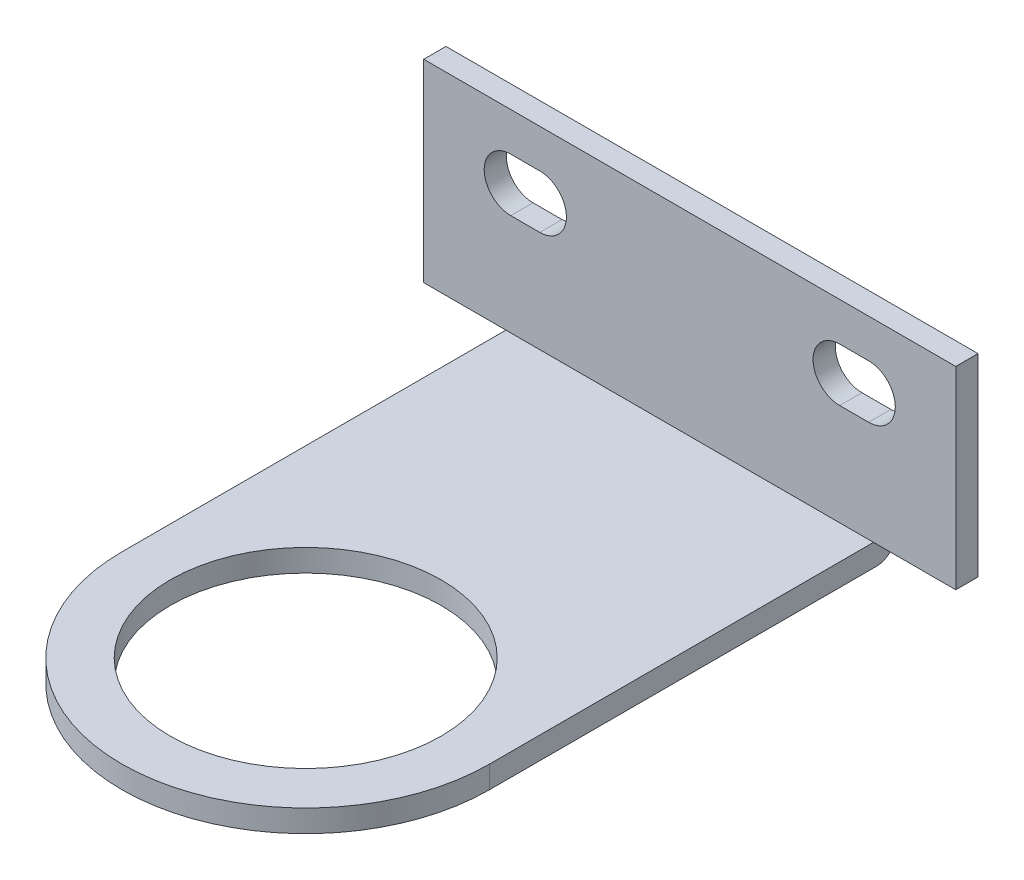
ISO-10303-21;
HEADER;
FILE_DESCRIPTION(('STEP AP214'),'2;1');
FILE_NAME('part.step','',(''),(''),'','','');
FILE_SCHEMA(('AUTOMOTIVE_DESIGN { 1 0 10303 214 1 1 1 1 }'));
ENDSEC;
DATA;
#1=APPLICATION_CONTEXT('core data for automotive mechanical design processes');
#2=APPLICATION_PROTOCOL_DEFINITION('international standard','automotive_design',2000,#1);
#3=PRODUCT_CONTEXT('',#1,'mechanical');
#4=PRODUCT('Part','Part','',(#3));
#5=PRODUCT_RELATED_PRODUCT_CATEGORY('part','',(#4));
#6=PRODUCT_DEFINITION_FORMATION('','',#4);
#7=PRODUCT_DEFINITION_CONTEXT('part definition',#1,'design');
#8=PRODUCT_DEFINITION('design','',#6,#7);
#9=PRODUCT_DEFINITION_SHAPE('','',#8);
#10=(LENGTH_UNIT() NAMED_UNIT(*) SI_UNIT(.MILLI.,.METRE.));
#11=(NAMED_UNIT(*) PLANE_ANGLE_UNIT() SI_UNIT($,.RADIAN.));
#12=(NAMED_UNIT(*) SI_UNIT($,.STERADIAN.) SOLID_ANGLE_UNIT());
#13=UNCERTAINTY_MEASURE_WITH_UNIT(LENGTH_MEASURE(1.E-05),#10,'distance_accuracy_value','');
#14=(GEOMETRIC_REPRESENTATION_CONTEXT(3) GLOBAL_UNCERTAINTY_ASSIGNED_CONTEXT((#13)) GLOBAL_UNIT_ASSIGNED_CONTEXT((#10,
#11,#12)) REPRESENTATION_CONTEXT('',''));
#15=CARTESIAN_POINT('',(0.,0.,0.));
#16=DIRECTION('',(0.,0.,1.));
#17=DIRECTION('',(1.,0.,0.));
#18=AXIS2_PLACEMENT_3D('',#15,#16,#17);
#19=CARTESIAN_POINT('',(0.,2.3,0.));
#20=DIRECTION('',(0.,1.,0.));
#21=DIRECTION('',(0.,0.,1.));
#22=AXIS2_PLACEMENT_3D('',#19,#20,#21);
#23=PLANE('',#22);
#24=DIRECTION('',(1.,0.,0.));
#25=VECTOR('',#24,1.);
#26=CARTESIAN_POINT('',(-27.5,2.3,-39.7));
#27=LINE('',#26,#25);
#28=CARTESIAN_POINT('',(-19.,2.3,-39.7));
#29=VERTEX_POINT('',#28);
#30=CARTESIAN_POINT('',(19.,2.3,-39.7));
#31=VERTEX_POINT('',#30);
#32=EDGE_CURVE('E221',#29,#31,#27,.T.);
#33=ORIENTED_EDGE('',*,*,#32,.F.);
#34=DIRECTION('',(0.,0.,1.));
#35=VECTOR('',#34,1.);
#36=CARTESIAN_POINT('',(-19.,2.3,0.));
#37=LINE('',#36,#35);
#38=CARTESIAN_POINT('',(-19.,2.3,0.));
#39=VERTEX_POINT('',#38);
#40=EDGE_CURVE('E265',#29,#39,#37,.T.);
#41=ORIENTED_EDGE('',*,*,#40,.T.);
#42=CARTESIAN_POINT('',(0.,2.3,0.));
#43=DIRECTION('',(0.,1.,0.));
#44=DIRECTION('',(0.,0.,1.));
#45=AXIS2_PLACEMENT_3D('',#42,#43,#44);
#46=CIRCLE('',#45,19.);
#47=CARTESIAN_POINT('',(19.,2.3,0.));
#48=VERTEX_POINT('',#47);
#49=EDGE_CURVE('E291',#39,#48,#46,.T.);
#50=ORIENTED_EDGE('',*,*,#49,.T.);
#51=DIRECTION('',(0.,0.,-1.));
#52=VECTOR('',#51,1.);
#53=CARTESIAN_POINT('',(19.,2.3,0.));
#54=LINE('',#53,#52);
#55=EDGE_CURVE('E270',#48,#31,#54,.T.);
#56=ORIENTED_EDGE('',*,*,#55,.T.);
#57=EDGE_LOOP('',(#33,#41,#50,#56));
#58=FACE_BOUND('',#57,.T.);
#59=CARTESIAN_POINT('',(0.,2.3,0.));
#60=DIRECTION('',(0.,1.,0.));
#61=DIRECTION('',(0.,0.,1.));
#62=AXIS2_PLACEMENT_3D('',#59,#60,#61);
#63=CIRCLE('',#62,14.);
#64=CARTESIAN_POINT('',(0.,2.3,14.));
#65=VERTEX_POINT('',#64);
#66=EDGE_CURVE('E287',#65,#65,#63,.T.);
#67=ORIENTED_EDGE('',*,*,#66,.F.);
#68=EDGE_LOOP('',(#67));
#69=FACE_BOUND('',#68,.T.);
#70=ADVANCED_FACE('F32',(#58,#69),#23,.T.);
#71=CARTESIAN_POINT('',(0.,0.,0.));
#72=DIRECTION('',(0.,1.,0.));
#73=DIRECTION('',(0.,0.,1.));
#74=AXIS2_PLACEMENT_3D('',#71,#72,#73);
#75=PLANE('',#74);
#76=DIRECTION('',(0.,0.,1.));
#77=VECTOR('',#76,1.);
#78=CARTESIAN_POINT('',(-19.,0.,0.));
#79=LINE('',#78,#77);
#80=CARTESIAN_POINT('',(-19.,0.,-40.));
#81=VERTEX_POINT('',#80);
#82=CARTESIAN_POINT('',(-19.,0.,0.));
#83=VERTEX_POINT('',#82);
#84=EDGE_CURVE('E290',#81,#83,#79,.T.);
#85=ORIENTED_EDGE('',*,*,#84,.F.);
#86=DIRECTION('',(-1.,0.,0.));
#87=VECTOR('',#86,1.);
#88=CARTESIAN_POINT('',(0.,0.,-40.));
#89=LINE('',#88,#87);
#90=CARTESIAN_POINT('',(19.,0.,-40.));
#91=VERTEX_POINT('',#90);
#92=EDGE_CURVE('E307',#81,#91,#89,.F.);
#93=ORIENTED_EDGE('',*,*,#92,.T.);
#94=DIRECTION('',(0.,0.,-1.));
#95=VECTOR('',#94,1.);
#96=CARTESIAN_POINT('',(19.,0.,0.));
#97=LINE('',#96,#95);
#98=CARTESIAN_POINT('',(19.,0.,0.));
#99=VERTEX_POINT('',#98);
#100=EDGE_CURVE('E286',#99,#91,#97,.T.);
#101=ORIENTED_EDGE('',*,*,#100,.F.);
#102=CARTESIAN_POINT('',(0.,0.,0.));
#103=DIRECTION('',(0.,1.,0.));
#104=DIRECTION('',(0.,0.,1.));
#105=AXIS2_PLACEMENT_3D('',#102,#103,#104);
#106=CIRCLE('',#105,19.);
#107=EDGE_CURVE('E283',#83,#99,#106,.T.);
#108=ORIENTED_EDGE('',*,*,#107,.F.);
#109=EDGE_LOOP('',(#85,#93,#101,#108));
#110=FACE_BOUND('',#109,.T.);
#111=CARTESIAN_POINT('',(0.,0.,0.));
#112=DIRECTION('',(0.,1.,0.));
#113=DIRECTION('',(0.,0.,1.));
#114=AXIS2_PLACEMENT_3D('',#111,#112,#113);
#115=CIRCLE('',#114,14.);
#116=CARTESIAN_POINT('',(0.,0.,14.));
#117=VERTEX_POINT('',#116);
#118=EDGE_CURVE('E238',#117,#117,#115,.T.);
#119=ORIENTED_EDGE('',*,*,#118,.T.);
#120=EDGE_LOOP('',(#119));
#121=FACE_BOUND('',#120,.T.);
#122=ADVANCED_FACE('F346',(#110,#121),#75,.F.);
#123=CARTESIAN_POINT('',(0.,2.3,0.));
#124=DIRECTION('',(0.,-1.,0.));
#125=DIRECTION('',(0.,0.,-1.));
#126=AXIS2_PLACEMENT_3D('',#123,#124,#125);
#127=CYLINDRICAL_SURFACE('',#126,19.);
#128=ORIENTED_EDGE('',*,*,#107,.T.);
#129=DIRECTION('',(0.,-1.,0.));
#130=VECTOR('',#129,1.);
#131=CARTESIAN_POINT('',(19.,2.3,0.));
#132=LINE('',#131,#130);
#133=EDGE_CURVE('E293',#48,#99,#132,.T.);
#134=ORIENTED_EDGE('',*,*,#133,.F.);
#135=ORIENTED_EDGE('',*,*,#49,.F.);
#136=DIRECTION('',(0.,-1.,0.));
#137=VECTOR('',#136,1.);
#138=CARTESIAN_POINT('',(-19.,2.3,0.));
#139=LINE('',#138,#137);
#140=EDGE_CURVE('E264',#39,#83,#139,.T.);
#141=ORIENTED_EDGE('',*,*,#140,.T.);
#142=EDGE_LOOP('',(#128,#134,#135,#141));
#143=FACE_BOUND('',#142,.T.);
#144=ADVANCED_FACE('F352',(#143),#127,.T.);
#145=CARTESIAN_POINT('',(19.,2.3,0.));
#146=DIRECTION('',(-1.,0.,0.));
#147=DIRECTION('',(0.,0.,1.));
#148=AXIS2_PLACEMENT_3D('',#145,#146,#147);
#149=PLANE('',#148);
#150=ORIENTED_EDGE('',*,*,#100,.T.);
#151=CARTESIAN_POINT('',(19.,2.,-40.));
#152=DIRECTION('',(-1.,0.,0.));
#153=DIRECTION('',(0.,0.,1.));
#154=AXIS2_PLACEMENT_3D('',#151,#152,#153);
#155=CIRCLE('',#154,2.);
#156=CARTESIAN_POINT('',(19.,2.,-42.));
#157=VERTEX_POINT('',#156);
#158=EDGE_CURVE('E309',#91,#157,#155,.F.);
#159=ORIENTED_EDGE('',*,*,#158,.T.);
#160=DIRECTION('',(0.,-1.,0.));
#161=VECTOR('',#160,1.);
#162=CARTESIAN_POINT('',(19.,2.3,-42.));
#163=LINE('',#162,#161);
#164=CARTESIAN_POINT('',(19.,2.3,-42.));
#165=VERTEX_POINT('',#164);
#166=EDGE_CURVE('E295',#165,#157,#163,.T.);
#167=ORIENTED_EDGE('',*,*,#166,.F.);
#168=EDGE_CURVE('E276',#31,#165,#54,.T.);
#169=ORIENTED_EDGE('',*,*,#168,.F.);
#170=ORIENTED_EDGE('',*,*,#55,.F.);
#171=ORIENTED_EDGE('',*,*,#133,.T.);
#172=EDGE_LOOP('',(#150,#159,#167,#169,#170,#171));
#173=FACE_BOUND('',#172,.T.);
#174=ADVANCED_FACE('F365',(#173),#149,.F.);
#175=CARTESIAN_POINT('',(-19.,2.3,-42.));
#176=DIRECTION('',(0.,0.,1.));
#177=DIRECTION('',(1.,0.,0.));
#178=AXIS2_PLACEMENT_3D('',#175,#176,#177);
#179=PLANE('',#178);
#180=DIRECTION('',(-1.,0.,0.));
#181=VECTOR('',#180,1.);
#182=CARTESIAN_POINT('',(-15.5,12.8,-42.));
#183=LINE('',#182,#181);
#184=CARTESIAN_POINT('',(-15.5,12.8,-42.));
#185=VERTEX_POINT('',#184);
#186=CARTESIAN_POINT('',(-18.5,12.8,-42.));
#187=VERTEX_POINT('',#186);
#188=EDGE_CURVE('E169',#185,#187,#183,.T.);
#189=ORIENTED_EDGE('',*,*,#188,.F.);
#190=CARTESIAN_POINT('',(-15.5,15.55,-42.));
#191=DIRECTION('',(0.,0.,-1.));
#192=DIRECTION('',(-1.,0.,0.));
#193=AXIS2_PLACEMENT_3D('',#190,#191,#192);
#194=CIRCLE('',#193,2.75);
#195=CARTESIAN_POINT('',(-15.5,18.3,-42.));
#196=VERTEX_POINT('',#195);
#197=EDGE_CURVE('E47',#196,#185,#194,.T.);
#198=ORIENTED_EDGE('',*,*,#197,.F.);
#199=DIRECTION('',(1.,0.,0.));
#200=VECTOR('',#199,1.);
#201=CARTESIAN_POINT('',(-15.5,18.3,-42.));
#202=LINE('',#201,#200);
#203=CARTESIAN_POINT('',(-18.5,18.3,-42.));
#204=VERTEX_POINT('',#203);
#205=EDGE_CURVE('E176',#204,#196,#202,.T.);
#206=ORIENTED_EDGE('',*,*,#205,.F.);
#207=CARTESIAN_POINT('',(-18.5,15.55,-42.));
#208=DIRECTION('',(0.,0.,-1.));
#209=DIRECTION('',(-1.,0.,0.));
#210=AXIS2_PLACEMENT_3D('',#207,#208,#209);
#211=CIRCLE('',#210,2.75);
#212=EDGE_CURVE('E160',#187,#204,#211,.T.);
#213=ORIENTED_EDGE('',*,*,#212,.F.);
#214=EDGE_LOOP('',(#189,#198,#206,#213));
#215=FACE_BOUND('',#214,.T.);
#216=DIRECTION('',(-1.,0.,0.));
#217=VECTOR('',#216,1.);
#218=CARTESIAN_POINT('',(18.5,12.8,-42.));
#219=LINE('',#218,#217);
#220=CARTESIAN_POINT('',(18.5,12.8,-42.));
#221=VERTEX_POINT('',#220);
#222=CARTESIAN_POINT('',(15.5,12.8,-42.));
#223=VERTEX_POINT('',#222);
#224=EDGE_CURVE('E187',#221,#223,#219,.T.);
#225=ORIENTED_EDGE('',*,*,#224,.F.);
#226=CARTESIAN_POINT('',(18.5,15.55,-42.));
#227=DIRECTION('',(0.,0.,-1.));
#228=DIRECTION('',(-1.,0.,0.));
#229=AXIS2_PLACEMENT_3D('',#226,#227,#228);
#230=CIRCLE('',#229,2.75);
#231=CARTESIAN_POINT('',(18.5,18.3,-42.));
#232=VERTEX_POINT('',#231);
#233=EDGE_CURVE('E183',#232,#221,#230,.T.);
#234=ORIENTED_EDGE('',*,*,#233,.F.);
#235=DIRECTION('',(1.,0.,0.));
#236=VECTOR('',#235,1.);
#237=CARTESIAN_POINT('',(18.5,18.3,-42.));
#238=LINE('',#237,#236);
#239=CARTESIAN_POINT('',(15.5,18.3,-42.));
#240=VERTEX_POINT('',#239);
#241=EDGE_CURVE('E193',#240,#232,#238,.T.);
#242=ORIENTED_EDGE('',*,*,#241,.F.);
#243=CARTESIAN_POINT('',(15.5,15.55,-42.));
#244=DIRECTION('',(0.,0.,-1.));
#245=DIRECTION('',(-1.,0.,0.));
#246=AXIS2_PLACEMENT_3D('',#243,#244,#245);
#247=CIRCLE('',#246,2.75);
#248=EDGE_CURVE('E190',#223,#240,#247,.T.);
#249=ORIENTED_EDGE('',*,*,#248,.F.);
#250=EDGE_LOOP('',(#225,#234,#242,#249));
#251=FACE_BOUND('',#250,.T.);
#252=ORIENTED_EDGE('',*,*,#166,.T.);
#253=DIRECTION('',(-1.,0.,0.));
#254=VECTOR('',#253,1.);
#255=CARTESIAN_POINT('',(-19.,2.,-42.));
#256=LINE('',#255,#254);
#257=CARTESIAN_POINT('',(-19.,2.,-42.));
#258=VERTEX_POINT('',#257);
#259=EDGE_CURVE('E303',#157,#258,#256,.T.);
#260=ORIENTED_EDGE('',*,*,#259,.T.);
#261=DIRECTION('',(0.,-1.,0.));
#262=VECTOR('',#261,1.);
#263=CARTESIAN_POINT('',(-19.,2.3,-42.));
#264=LINE('',#263,#262);
#265=CARTESIAN_POINT('',(-19.,2.3,-42.));
#266=VERTEX_POINT('',#265);
#267=EDGE_CURVE('E268',#266,#258,#264,.T.);
#268=ORIENTED_EDGE('',*,*,#267,.F.);
#269=DIRECTION('',(-1.,0.,0.));
#270=VECTOR('',#269,1.);
#271=CARTESIAN_POINT('',(0.,2.3,-42.));
#272=LINE('',#271,#270);
#273=CARTESIAN_POINT('',(-27.5,2.3,-42.));
#274=VERTEX_POINT('',#273);
#275=EDGE_CURVE('E224',#266,#274,#272,.T.);
#276=ORIENTED_EDGE('',*,*,#275,.T.);
#277=DIRECTION('',(0.,-1.,0.));
#278=VECTOR('',#277,1.);
#279=CARTESIAN_POINT('',(-27.5,22.3,-42.));
#280=LINE('',#279,#278);
#281=CARTESIAN_POINT('',(-27.5,22.3,-42.));
#282=VERTEX_POINT('',#281);
#283=EDGE_CURVE('E242',#282,#274,#280,.T.);
#284=ORIENTED_EDGE('',*,*,#283,.F.);
#285=DIRECTION('',(-1.,0.,0.));
#286=VECTOR('',#285,1.);
#287=CARTESIAN_POINT('',(0.,22.3,-42.));
#288=LINE('',#287,#286);
#289=CARTESIAN_POINT('',(27.5,22.3,-42.));
#290=VERTEX_POINT('',#289);
#291=EDGE_CURVE('E212',#290,#282,#288,.T.);
#292=ORIENTED_EDGE('',*,*,#291,.F.);
#293=DIRECTION('',(0.,-1.,0.));
#294=VECTOR('',#293,1.);
#295=CARTESIAN_POINT('',(27.5,22.3,-42.));
#296=LINE('',#295,#294);
#297=CARTESIAN_POINT('',(27.5,2.3,-42.));
#298=VERTEX_POINT('',#297);
#299=EDGE_CURVE('E239',#290,#298,#296,.T.);
#300=ORIENTED_EDGE('',*,*,#299,.T.);
#301=EDGE_CURVE('E232',#298,#165,#272,.T.);
#302=ORIENTED_EDGE('',*,*,#301,.T.);
#303=EDGE_LOOP('',(#252,#260,#268,#276,#284,#292,#300,#302));
#304=FACE_BOUND('',#303,.T.);
#305=ADVANCED_FACE('F173',(#215,#251,#304),#179,.F.);
#306=CARTESIAN_POINT('',(-19.,2.3,0.));
#307=DIRECTION('',(1.,0.,0.));
#308=DIRECTION('',(0.,0.,-1.));
#309=AXIS2_PLACEMENT_3D('',#306,#307,#308);
#310=PLANE('',#309);
#311=ORIENTED_EDGE('',*,*,#267,.T.);
#312=CARTESIAN_POINT('',(-19.,2.,-40.));
#313=DIRECTION('',(1.,0.,0.));
#314=DIRECTION('',(0.,0.,-1.));
#315=AXIS2_PLACEMENT_3D('',#312,#313,#314);
#316=CIRCLE('',#315,2.);
#317=EDGE_CURVE('E305',#258,#81,#316,.F.);
#318=ORIENTED_EDGE('',*,*,#317,.T.);
#319=ORIENTED_EDGE('',*,*,#84,.T.);
#320=ORIENTED_EDGE('',*,*,#140,.F.);
#321=ORIENTED_EDGE('',*,*,#40,.F.);
#322=EDGE_CURVE('E260',#266,#29,#37,.T.);
#323=ORIENTED_EDGE('',*,*,#322,.F.);
#324=EDGE_LOOP('',(#311,#318,#319,#320,#321,#323));
#325=FACE_BOUND('',#324,.T.);
#326=ADVANCED_FACE('F360',(#325),#310,.F.);
#327=CARTESIAN_POINT('',(0.,2.3,0.));
#328=DIRECTION('',(0.,-1.,0.));
#329=DIRECTION('',(0.,0.,-1.));
#330=AXIS2_PLACEMENT_3D('',#327,#328,#329);
#331=CYLINDRICAL_SURFACE('',#330,14.);
#332=ORIENTED_EDGE('',*,*,#66,.T.);
#333=EDGE_LOOP('',(#332));
#334=FACE_BOUND('',#333,.T.);
#335=ORIENTED_EDGE('',*,*,#118,.F.);
#336=EDGE_LOOP('',(#335));
#337=FACE_BOUND('',#336,.T.);
#338=ADVANCED_FACE('F357',(#334,#337),#331,.F.);
#339=CARTESIAN_POINT('',(27.5,2.3,-39.7));
#340=DIRECTION('',(0.,-1.,0.));
#341=DIRECTION('',(0.,0.,-1.));
#342=AXIS2_PLACEMENT_3D('',#339,#340,#341);
#343=PLANE('',#342);
#344=CARTESIAN_POINT('',(27.5,2.3,-39.7));
#345=VERTEX_POINT('',#344);
#346=EDGE_CURVE('E199',#31,#345,#27,.T.);
#347=ORIENTED_EDGE('',*,*,#346,.F.);
#348=ORIENTED_EDGE('',*,*,#168,.T.);
#349=ORIENTED_EDGE('',*,*,#301,.F.);
#350=DIRECTION('',(0.,0.,-1.));
#351=VECTOR('',#350,1.);
#352=CARTESIAN_POINT('',(27.5,2.3,-42.));
#353=LINE('',#352,#351);
#354=EDGE_CURVE('E220',#345,#298,#353,.T.);
#355=ORIENTED_EDGE('',*,*,#354,.F.);
#356=EDGE_LOOP('',(#347,#348,#349,#355));
#357=FACE_BOUND('',#356,.T.);
#358=ADVANCED_FACE('F391',(#357),#343,.T.);
#359=CARTESIAN_POINT('',(-27.5,22.3,-39.7));
#360=DIRECTION('',(0.,0.,-1.));
#361=DIRECTION('',(-1.,0.,0.));
#362=AXIS2_PLACEMENT_3D('',#359,#360,#361);
#363=PLANE('',#362);
#364=DIRECTION('',(1.,0.,0.));
#365=VECTOR('',#364,1.);
#366=CARTESIAN_POINT('',(-27.5,18.3,-39.7));
#367=LINE('',#366,#365);
#368=CARTESIAN_POINT('',(-18.5,18.3,-39.7));
#369=VERTEX_POINT('',#368);
#370=CARTESIAN_POINT('',(-15.5,18.3,-39.7));
#371=VERTEX_POINT('',#370);
#372=EDGE_CURVE('E40',#369,#371,#367,.T.);
#373=ORIENTED_EDGE('',*,*,#372,.T.);
#374=CARTESIAN_POINT('',(-15.5,15.55,-39.7));
#375=DIRECTION('',(0.,0.,-1.));
#376=DIRECTION('',(-1.,0.,0.));
#377=AXIS2_PLACEMENT_3D('',#374,#375,#376);
#378=CIRCLE('',#377,2.75);
#379=CARTESIAN_POINT('',(-15.5,12.8,-39.7));
#380=VERTEX_POINT('',#379);
#381=EDGE_CURVE('E11',#371,#380,#378,.T.);
#382=ORIENTED_EDGE('',*,*,#381,.T.);
#383=DIRECTION('',(-1.,0.,0.));
#384=VECTOR('',#383,1.);
#385=CARTESIAN_POINT('',(-27.5,12.8,-39.7));
#386=LINE('',#385,#384);
#387=CARTESIAN_POINT('',(-18.5,12.8,-39.7));
#388=VERTEX_POINT('',#387);
#389=EDGE_CURVE('E323',#380,#388,#386,.T.);
#390=ORIENTED_EDGE('',*,*,#389,.T.);
#391=CARTESIAN_POINT('',(-18.5,15.55,-39.7));
#392=DIRECTION('',(0.,0.,-1.));
#393=DIRECTION('',(-1.,0.,0.));
#394=AXIS2_PLACEMENT_3D('',#391,#392,#393);
#395=CIRCLE('',#394,2.75);
#396=EDGE_CURVE('E163',#388,#369,#395,.T.);
#397=ORIENTED_EDGE('',*,*,#396,.T.);
#398=EDGE_LOOP('',(#373,#382,#390,#397));
#399=FACE_BOUND('',#398,.T.);
#400=DIRECTION('',(1.,0.,0.));
#401=VECTOR('',#400,1.);
#402=CARTESIAN_POINT('',(-27.5,18.3,-39.7));
#403=LINE('',#402,#401);
#404=CARTESIAN_POINT('',(15.5,18.3,-39.7));
#405=VERTEX_POINT('',#404);
#406=CARTESIAN_POINT('',(18.5,18.3,-39.7));
#407=VERTEX_POINT('',#406);
#408=EDGE_CURVE('E317',#405,#407,#403,.T.);
#409=ORIENTED_EDGE('',*,*,#408,.T.);
#410=CARTESIAN_POINT('',(18.5,15.55,-39.7));
#411=DIRECTION('',(0.,0.,-1.));
#412=DIRECTION('',(-1.,0.,0.));
#413=AXIS2_PLACEMENT_3D('',#410,#411,#412);
#414=CIRCLE('',#413,2.75);
#415=CARTESIAN_POINT('',(18.5,12.8,-39.7));
#416=VERTEX_POINT('',#415);
#417=EDGE_CURVE('E320',#407,#416,#414,.T.);
#418=ORIENTED_EDGE('',*,*,#417,.T.);
#419=DIRECTION('',(-1.,0.,0.));
#420=VECTOR('',#419,1.);
#421=CARTESIAN_POINT('',(-27.5,12.8,-39.7));
#422=LINE('',#421,#420);
#423=CARTESIAN_POINT('',(15.5,12.8,-39.7));
#424=VERTEX_POINT('',#423);
#425=EDGE_CURVE('E311',#416,#424,#422,.T.);
#426=ORIENTED_EDGE('',*,*,#425,.T.);
#427=CARTESIAN_POINT('',(15.5,15.55,-39.7));
#428=DIRECTION('',(0.,0.,-1.));
#429=DIRECTION('',(-1.,0.,0.));
#430=AXIS2_PLACEMENT_3D('',#427,#428,#429);
#431=CIRCLE('',#430,2.75);
#432=EDGE_CURVE('E314',#424,#405,#431,.T.);
#433=ORIENTED_EDGE('',*,*,#432,.T.);
#434=EDGE_LOOP('',(#409,#418,#426,#433));
#435=FACE_BOUND('',#434,.T.);
#436=CARTESIAN_POINT('',(-27.5,2.3,-39.7));
#437=VERTEX_POINT('',#436);
#438=EDGE_CURVE('E217',#437,#29,#27,.T.);
#439=ORIENTED_EDGE('',*,*,#438,.T.);
#440=ORIENTED_EDGE('',*,*,#32,.T.);
#441=ORIENTED_EDGE('',*,*,#346,.T.);
#442=DIRECTION('',(0.,-1.,0.));
#443=VECTOR('',#442,1.);
#444=CARTESIAN_POINT('',(27.5,22.3,-39.7));
#445=LINE('',#444,#443);
#446=CARTESIAN_POINT('',(27.5,22.3,-39.7));
#447=VERTEX_POINT('',#446);
#448=EDGE_CURVE('E235',#447,#345,#445,.T.);
#449=ORIENTED_EDGE('',*,*,#448,.F.);
#450=DIRECTION('',(1.,0.,0.));
#451=VECTOR('',#450,1.);
#452=CARTESIAN_POINT('',(-27.5,22.3,-39.7));
#453=LINE('',#452,#451);
#454=CARTESIAN_POINT('',(-27.5,22.3,-39.7));
#455=VERTEX_POINT('',#454);
#456=EDGE_CURVE('E206',#455,#447,#453,.T.);
#457=ORIENTED_EDGE('',*,*,#456,.F.);
#458=DIRECTION('',(0.,-1.,0.));
#459=VECTOR('',#458,1.);
#460=CARTESIAN_POINT('',(-27.5,22.3,-39.7));
#461=LINE('',#460,#459);
#462=EDGE_CURVE('E216',#455,#437,#461,.T.);
#463=ORIENTED_EDGE('',*,*,#462,.T.);
#464=EDGE_LOOP('',(#439,#440,#441,#449,#457,#463));
#465=FACE_BOUND('',#464,.T.);
#466=ADVANCED_FACE('F249',(#399,#435,#465),#363,.F.);
#467=CARTESIAN_POINT('',(27.5,22.3,-42.));
#468=DIRECTION('',(-1.,0.,0.));
#469=DIRECTION('',(0.,0.,1.));
#470=AXIS2_PLACEMENT_3D('',#467,#468,#469);
#471=PLANE('',#470);
#472=ORIENTED_EDGE('',*,*,#354,.T.);
#473=ORIENTED_EDGE('',*,*,#299,.F.);
#474=DIRECTION('',(0.,0.,-1.));
#475=VECTOR('',#474,1.);
#476=CARTESIAN_POINT('',(27.5,22.3,-42.));
#477=LINE('',#476,#475);
#478=EDGE_CURVE('E209',#447,#290,#477,.T.);
#479=ORIENTED_EDGE('',*,*,#478,.F.);
#480=ORIENTED_EDGE('',*,*,#448,.T.);
#481=EDGE_LOOP('',(#472,#473,#479,#480));
#482=FACE_BOUND('',#481,.T.);
#483=ADVANCED_FACE('F401',(#482),#471,.F.);
#484=CARTESIAN_POINT('',(-27.5,22.3,-42.));
#485=DIRECTION('',(1.,0.,0.));
#486=DIRECTION('',(0.,0.,-1.));
#487=AXIS2_PLACEMENT_3D('',#484,#485,#486);
#488=PLANE('',#487);
#489=DIRECTION('',(0.,0.,1.));
#490=VECTOR('',#489,1.);
#491=CARTESIAN_POINT('',(-27.5,2.3,-42.));
#492=LINE('',#491,#490);
#493=EDGE_CURVE('E210',#274,#437,#492,.T.);
#494=ORIENTED_EDGE('',*,*,#493,.T.);
#495=ORIENTED_EDGE('',*,*,#462,.F.);
#496=DIRECTION('',(0.,0.,1.));
#497=VECTOR('',#496,1.);
#498=CARTESIAN_POINT('',(-27.5,22.3,-42.));
#499=LINE('',#498,#497);
#500=EDGE_CURVE('E214',#282,#455,#499,.T.);
#501=ORIENTED_EDGE('',*,*,#500,.F.);
#502=ORIENTED_EDGE('',*,*,#283,.T.);
#503=EDGE_LOOP('',(#494,#495,#501,#502));
#504=FACE_BOUND('',#503,.T.);
#505=ADVANCED_FACE('F412',(#504),#488,.F.);
#506=CARTESIAN_POINT('',(27.5,22.3,-39.7));
#507=DIRECTION('',(0.,-1.,0.));
#508=DIRECTION('',(0.,0.,-1.));
#509=AXIS2_PLACEMENT_3D('',#506,#507,#508);
#510=PLANE('',#509);
#511=ORIENTED_EDGE('',*,*,#456,.T.);
#512=ORIENTED_EDGE('',*,*,#478,.T.);
#513=ORIENTED_EDGE('',*,*,#291,.T.);
#514=ORIENTED_EDGE('',*,*,#500,.T.);
#515=EDGE_LOOP('',(#511,#512,#513,#514));
#516=FACE_BOUND('',#515,.T.);
#517=ADVANCED_FACE('F405',(#516),#510,.F.);
#518=ORIENTED_EDGE('',*,*,#275,.F.);
#519=ORIENTED_EDGE('',*,*,#322,.T.);
#520=ORIENTED_EDGE('',*,*,#438,.F.);
#521=ORIENTED_EDGE('',*,*,#493,.F.);
#522=EDGE_LOOP('',(#518,#519,#520,#521));
#523=FACE_BOUND('',#522,.T.);
#524=ADVANCED_FACE('F258',(#523),#343,.T.);
#525=CARTESIAN_POINT('',(-19.,2.,-40.));
#526=DIRECTION('',(-1.,0.,0.));
#527=DIRECTION('',(0.,0.,1.));
#528=AXIS2_PLACEMENT_3D('',#525,#526,#527);
#529=CYLINDRICAL_SURFACE('',#528,2.);
#530=ORIENTED_EDGE('',*,*,#158,.F.);
#531=ORIENTED_EDGE('',*,*,#92,.F.);
#532=ORIENTED_EDGE('',*,*,#317,.F.);
#533=ORIENTED_EDGE('',*,*,#259,.F.);
#534=EDGE_LOOP('',(#530,#531,#532,#533));
#535=FACE_BOUND('',#534,.T.);
#536=ADVANCED_FACE('F34',(#535),#529,.T.);
#537=CARTESIAN_POINT('',(18.5,15.55,19.));
#538=DIRECTION('',(0.,0.,-1.));
#539=DIRECTION('',(-1.,0.,0.));
#540=AXIS2_PLACEMENT_3D('',#537,#538,#539);
#541=CYLINDRICAL_SURFACE('',#540,2.75);
#542=DIRECTION('',(0.,0.,-1.));
#543=VECTOR('',#542,1.);
#544=CARTESIAN_POINT('',(18.5,18.3,19.));
#545=LINE('',#544,#543);
#546=EDGE_CURVE('E197',#407,#232,#545,.T.);
#547=ORIENTED_EDGE('',*,*,#546,.T.);
#548=ORIENTED_EDGE('',*,*,#233,.T.);
#549=DIRECTION('',(0.,0.,-1.));
#550=VECTOR('',#549,1.);
#551=CARTESIAN_POINT('',(18.5,12.8,19.));
#552=LINE('',#551,#550);
#553=EDGE_CURVE('E196',#416,#221,#552,.T.);
#554=ORIENTED_EDGE('',*,*,#553,.F.);
#555=ORIENTED_EDGE('',*,*,#417,.F.);
#556=EDGE_LOOP('',(#547,#548,#554,#555));
#557=FACE_BOUND('',#556,.T.);
#558=ADVANCED_FACE('F410',(#557),#541,.F.);
#559=CARTESIAN_POINT('',(18.5,18.3,19.));
#560=DIRECTION('',(0.,1.,0.));
#561=DIRECTION('',(0.,0.,1.));
#562=AXIS2_PLACEMENT_3D('',#559,#560,#561);
#563=PLANE('',#562);
#564=DIRECTION('',(0.,0.,-1.));
#565=VECTOR('',#564,1.);
#566=CARTESIAN_POINT('',(15.5,18.3,19.));
#567=LINE('',#566,#565);
#568=EDGE_CURVE('E200',#405,#240,#567,.T.);
#569=ORIENTED_EDGE('',*,*,#568,.T.);
#570=ORIENTED_EDGE('',*,*,#241,.T.);
#571=ORIENTED_EDGE('',*,*,#546,.F.);
#572=ORIENTED_EDGE('',*,*,#408,.F.);
#573=EDGE_LOOP('',(#569,#570,#571,#572));
#574=FACE_BOUND('',#573,.T.);
#575=ADVANCED_FACE('F419',(#574),#563,.F.);
#576=CARTESIAN_POINT('',(15.5,15.55,19.));
#577=DIRECTION('',(0.,0.,-1.));
#578=DIRECTION('',(-1.,0.,0.));
#579=AXIS2_PLACEMENT_3D('',#576,#577,#578);
#580=CYLINDRICAL_SURFACE('',#579,2.75);
#581=DIRECTION('',(0.,0.,-1.));
#582=VECTOR('',#581,1.);
#583=CARTESIAN_POINT('',(15.5,12.8,19.));
#584=LINE('',#583,#582);
#585=EDGE_CURVE('E202',#424,#223,#584,.T.);
#586=ORIENTED_EDGE('',*,*,#585,.T.);
#587=ORIENTED_EDGE('',*,*,#248,.T.);
#588=ORIENTED_EDGE('',*,*,#568,.F.);
#589=ORIENTED_EDGE('',*,*,#432,.F.);
#590=EDGE_LOOP('',(#586,#587,#588,#589));
#591=FACE_BOUND('',#590,.T.);
#592=ADVANCED_FACE('F340',(#591),#580,.F.);
#593=CARTESIAN_POINT('',(18.5,12.8,19.));
#594=DIRECTION('',(0.,-1.,0.));
#595=DIRECTION('',(0.,0.,-1.));
#596=AXIS2_PLACEMENT_3D('',#593,#594,#595);
#597=PLANE('',#596);
#598=ORIENTED_EDGE('',*,*,#553,.T.);
#599=ORIENTED_EDGE('',*,*,#224,.T.);
#600=ORIENTED_EDGE('',*,*,#585,.F.);
#601=ORIENTED_EDGE('',*,*,#425,.F.);
#602=EDGE_LOOP('',(#598,#599,#600,#601));
#603=FACE_BOUND('',#602,.T.);
#604=ADVANCED_FACE('F333',(#603),#597,.F.);
#605=CARTESIAN_POINT('',(-15.5,15.55,19.));
#606=DIRECTION('',(0.,0.,-1.));
#607=DIRECTION('',(-1.,0.,0.));
#608=AXIS2_PLACEMENT_3D('',#605,#606,#607);
#609=CYLINDRICAL_SURFACE('',#608,2.75);
#610=DIRECTION('',(0.,0.,-1.));
#611=VECTOR('',#610,1.);
#612=CARTESIAN_POINT('',(-15.5,18.3,19.));
#613=LINE('',#612,#611);
#614=EDGE_CURVE('E181',#371,#196,#613,.T.);
#615=ORIENTED_EDGE('',*,*,#614,.T.);
#616=ORIENTED_EDGE('',*,*,#197,.T.);
#617=DIRECTION('',(0.,0.,-1.));
#618=VECTOR('',#617,1.);
#619=CARTESIAN_POINT('',(-15.5,12.8,19.));
#620=LINE('',#619,#618);
#621=EDGE_CURVE('E166',#380,#185,#620,.T.);
#622=ORIENTED_EDGE('',*,*,#621,.F.);
#623=ORIENTED_EDGE('',*,*,#381,.F.);
#624=EDGE_LOOP('',(#615,#616,#622,#623));
#625=FACE_BOUND('',#624,.T.);
#626=ADVANCED_FACE('F331',(#625),#609,.F.);
#627=CARTESIAN_POINT('',(-15.5,18.3,19.));
#628=DIRECTION('',(0.,1.,0.));
#629=DIRECTION('',(0.,0.,1.));
#630=AXIS2_PLACEMENT_3D('',#627,#628,#629);
#631=PLANE('',#630);
#632=DIRECTION('',(0.,0.,-1.));
#633=VECTOR('',#632,1.);
#634=CARTESIAN_POINT('',(-18.5,18.3,19.));
#635=LINE('',#634,#633);
#636=EDGE_CURVE('E165',#369,#204,#635,.T.);
#637=ORIENTED_EDGE('',*,*,#636,.T.);
#638=ORIENTED_EDGE('',*,*,#205,.T.);
#639=ORIENTED_EDGE('',*,*,#614,.F.);
#640=ORIENTED_EDGE('',*,*,#372,.F.);
#641=EDGE_LOOP('',(#637,#638,#639,#640));
#642=FACE_BOUND('',#641,.T.);
#643=ADVANCED_FACE('F330',(#642),#631,.F.);
#644=CARTESIAN_POINT('',(-18.5,15.55,19.));
#645=DIRECTION('',(0.,0.,-1.));
#646=DIRECTION('',(-1.,0.,0.));
#647=AXIS2_PLACEMENT_3D('',#644,#645,#646);
#648=CYLINDRICAL_SURFACE('',#647,2.75);
#649=DIRECTION('',(0.,0.,-1.));
#650=VECTOR('',#649,1.);
#651=CARTESIAN_POINT('',(-18.5,12.8,19.));
#652=LINE('',#651,#650);
#653=EDGE_CURVE('E55',#388,#187,#652,.T.);
#654=ORIENTED_EDGE('',*,*,#653,.T.);
#655=ORIENTED_EDGE('',*,*,#212,.T.);
#656=ORIENTED_EDGE('',*,*,#636,.F.);
#657=ORIENTED_EDGE('',*,*,#396,.F.);
#658=EDGE_LOOP('',(#654,#655,#656,#657));
#659=FACE_BOUND('',#658,.T.);
#660=ADVANCED_FACE('F157',(#659),#648,.F.);
#661=CARTESIAN_POINT('',(-15.5,12.8,19.));
#662=DIRECTION('',(0.,-1.,0.));
#663=DIRECTION('',(0.,0.,-1.));
#664=AXIS2_PLACEMENT_3D('',#661,#662,#663);
#665=PLANE('',#664);
#666=ORIENTED_EDGE('',*,*,#621,.T.);
#667=ORIENTED_EDGE('',*,*,#188,.T.);
#668=ORIENTED_EDGE('',*,*,#653,.F.);
#669=ORIENTED_EDGE('',*,*,#389,.F.);
#670=EDGE_LOOP('',(#666,#667,#668,#669));
#671=FACE_BOUND('',#670,.T.);
#672=ADVANCED_FACE('F170',(#671),#665,.F.);
#673=CLOSED_SHELL('',(#70,#122,#144,#174,#305,#326,#338,#358,#466,#483,#505,#517,#524,#536,#558,
#575,#592,#604,#626,#643,#660,#672));
#674=MANIFOLD_SOLID_BREP('B2',#673);
#675=ADVANCED_BREP_SHAPE_REPRESENTATION('',(#18,#674),#14);
#676=SHAPE_DEFINITION_REPRESENTATION(#9,#675);
ENDSEC;
END-ISO-10303-21;
